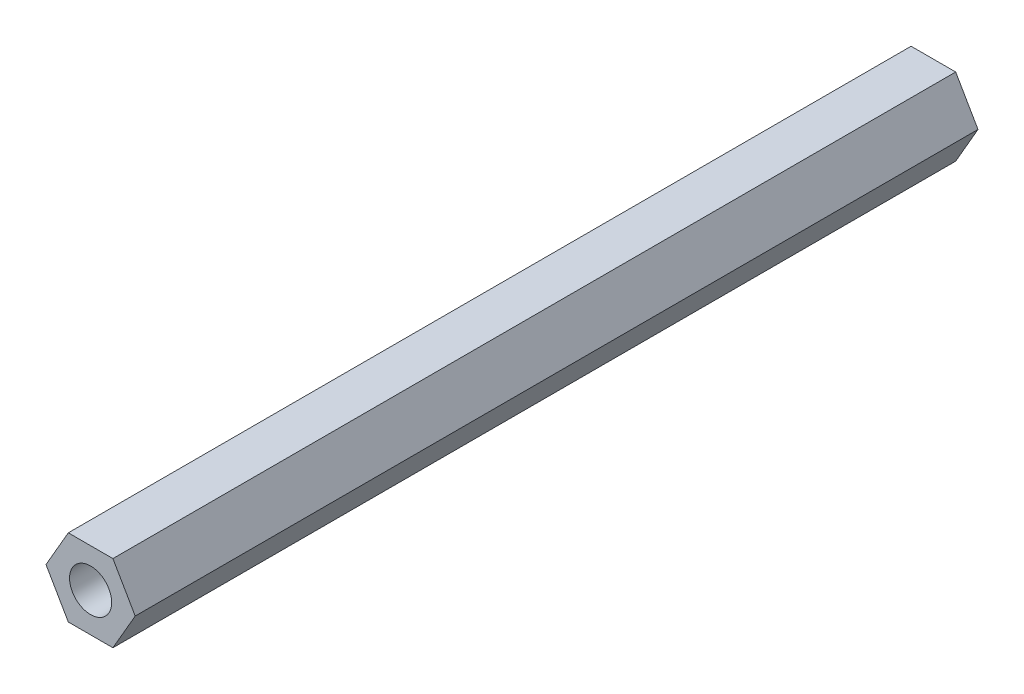
ISO-10303-21;
HEADER;
FILE_DESCRIPTION(('STEP AP214'),'2;1');
FILE_NAME('part.step','',(''),(''),'','','');
FILE_SCHEMA(('AUTOMOTIVE_DESIGN { 1 0 10303 214 1 1 1 1 }'));
ENDSEC;
DATA;
#1=APPLICATION_CONTEXT('core data for automotive mechanical design processes');
#2=APPLICATION_PROTOCOL_DEFINITION('international standard','automotive_design',2000,#1);
#3=PRODUCT_CONTEXT('',#1,'mechanical');
#4=PRODUCT('Part','Part','',(#3));
#5=PRODUCT_RELATED_PRODUCT_CATEGORY('part','',(#4));
#6=PRODUCT_DEFINITION_FORMATION('','',#4);
#7=PRODUCT_DEFINITION_CONTEXT('part definition',#1,'design');
#8=PRODUCT_DEFINITION('design','',#6,#7);
#9=PRODUCT_DEFINITION_SHAPE('','',#8);
#10=(LENGTH_UNIT() NAMED_UNIT(*) SI_UNIT(.MILLI.,.METRE.));
#11=(NAMED_UNIT(*) PLANE_ANGLE_UNIT() SI_UNIT($,.RADIAN.));
#12=(NAMED_UNIT(*) SI_UNIT($,.STERADIAN.) SOLID_ANGLE_UNIT());
#13=UNCERTAINTY_MEASURE_WITH_UNIT(LENGTH_MEASURE(1.E-05),#10,'distance_accuracy_value','');
#14=(GEOMETRIC_REPRESENTATION_CONTEXT(3) GLOBAL_UNCERTAINTY_ASSIGNED_CONTEXT((#13)) GLOBAL_UNIT_ASSIGNED_CONTEXT((#10,
#11,#12)) REPRESENTATION_CONTEXT('',''));
#15=CARTESIAN_POINT('',(0.,0.,0.));
#16=DIRECTION('',(0.,0.,1.));
#17=DIRECTION('',(1.,0.,0.));
#18=AXIS2_PLACEMENT_3D('',#15,#16,#17);
#19=CARTESIAN_POINT('',(0.,0.,60.));
#20=DIRECTION('',(0.,0.,1.));
#21=DIRECTION('',(1.,0.,0.));
#22=AXIS2_PLACEMENT_3D('',#19,#20,#21);
#23=PLANE('',#22);
#24=DIRECTION('',(0.499999999999995,0.866025403784441,0.));
#25=VECTOR('',#24,1.);
#26=CARTESIAN_POINT('',(1.5877132402715,-2.74999999999998,60.));
#27=LINE('',#26,#25);
#28=CARTESIAN_POINT('',(1.5877132402715,-2.74999999999998,60.));
#29=VERTEX_POINT('',#28);
#30=CARTESIAN_POINT('',(3.17542648054294,0.,60.));
#31=VERTEX_POINT('',#30);
#32=EDGE_CURVE('E129',#29,#31,#27,.T.);
#33=ORIENTED_EDGE('',*,*,#32,.T.);
#34=DIRECTION('',(-0.500000000000001,0.866025403784438,0.));
#35=VECTOR('',#34,1.);
#36=CARTESIAN_POINT('',(3.17542648054294,0.,60.));
#37=LINE('',#36,#35);
#38=CARTESIAN_POINT('',(1.58771324027147,2.75,60.));
#39=VERTEX_POINT('',#38);
#40=EDGE_CURVE('E87',#31,#39,#37,.T.);
#41=ORIENTED_EDGE('',*,*,#40,.T.);
#42=DIRECTION('',(-1.,0.,0.));
#43=VECTOR('',#42,1.);
#44=CARTESIAN_POINT('',(1.58771324027147,2.75,60.));
#45=LINE('',#44,#43);
#46=CARTESIAN_POINT('',(-1.58771324027148,2.74999999999999,60.));
#47=VERTEX_POINT('',#46);
#48=EDGE_CURVE('E100',#39,#47,#45,.T.);
#49=ORIENTED_EDGE('',*,*,#48,.T.);
#50=DIRECTION('',(-0.499999999999995,-0.866025403784442,0.));
#51=VECTOR('',#50,1.);
#52=CARTESIAN_POINT('',(-1.58771324027148,2.74999999999999,60.));
#53=LINE('',#52,#51);
#54=CARTESIAN_POINT('',(-3.17542648054294,0.,60.));
#55=VERTEX_POINT('',#54);
#56=EDGE_CURVE('E94',#47,#55,#53,.T.);
#57=ORIENTED_EDGE('',*,*,#56,.T.);
#58=DIRECTION('',(0.500000000000007,-0.866025403784435,0.));
#59=VECTOR('',#58,1.);
#60=CARTESIAN_POINT('',(-3.17542648054294,0.,60.));
#61=LINE('',#60,#59);
#62=CARTESIAN_POINT('',(-1.58771324027145,-2.75000000000002,60.));
#63=VERTEX_POINT('',#62);
#64=EDGE_CURVE('E98',#55,#63,#61,.T.);
#65=ORIENTED_EDGE('',*,*,#64,.T.);
#66=DIRECTION('',(1.,0.,0.));
#67=VECTOR('',#66,1.);
#68=CARTESIAN_POINT('',(-1.58771324027145,-2.75000000000002,60.));
#69=LINE('',#68,#67);
#70=EDGE_CURVE('E50',#63,#29,#69,.T.);
#71=ORIENTED_EDGE('',*,*,#70,.T.);
#72=EDGE_LOOP('',(#33,#41,#49,#57,#65,#71));
#73=FACE_BOUND('',#72,.T.);
#74=CARTESIAN_POINT('',(0.,0.,60.));
#75=DIRECTION('',(0.,0.,1.));
#76=DIRECTION('',(1.,0.,0.));
#77=AXIS2_PLACEMENT_3D('',#74,#75,#76);
#78=CIRCLE('',#77,1.5);
#79=CARTESIAN_POINT('',(1.5,0.,60.));
#80=VERTEX_POINT('',#79);
#81=EDGE_CURVE('E122',#80,#80,#78,.T.);
#82=ORIENTED_EDGE('',*,*,#81,.F.);
#83=EDGE_LOOP('',(#82));
#84=FACE_BOUND('',#83,.T.);
#85=ADVANCED_FACE('F33',(#73,#84),#23,.T.);
#86=CARTESIAN_POINT('',(0.,0.,0.));
#87=DIRECTION('',(0.,0.,1.));
#88=DIRECTION('',(1.,0.,0.));
#89=AXIS2_PLACEMENT_3D('',#86,#87,#88);
#90=PLANE('',#89);
#91=DIRECTION('',(0.499999999999995,0.866025403784441,0.));
#92=VECTOR('',#91,1.);
#93=CARTESIAN_POINT('',(1.5877132402715,-2.74999999999998,0.));
#94=LINE('',#93,#92);
#95=CARTESIAN_POINT('',(1.5877132402715,-2.74999999999998,0.));
#96=VERTEX_POINT('',#95);
#97=CARTESIAN_POINT('',(3.17542648054294,0.,0.));
#98=VERTEX_POINT('',#97);
#99=EDGE_CURVE('E118',#96,#98,#94,.T.);
#100=ORIENTED_EDGE('',*,*,#99,.F.);
#101=DIRECTION('',(1.,0.,0.));
#102=VECTOR('',#101,1.);
#103=CARTESIAN_POINT('',(-1.58771324027145,-2.75000000000002,0.));
#104=LINE('',#103,#102);
#105=CARTESIAN_POINT('',(-1.58771324027145,-2.75000000000002,0.));
#106=VERTEX_POINT('',#105);
#107=EDGE_CURVE('E79',#106,#96,#104,.T.);
#108=ORIENTED_EDGE('',*,*,#107,.F.);
#109=DIRECTION('',(0.500000000000007,-0.866025403784435,0.));
#110=VECTOR('',#109,1.);
#111=CARTESIAN_POINT('',(-3.17542648054294,0.,0.));
#112=LINE('',#111,#110);
#113=CARTESIAN_POINT('',(-3.17542648054294,0.,0.));
#114=VERTEX_POINT('',#113);
#115=EDGE_CURVE('E73',#114,#106,#112,.T.);
#116=ORIENTED_EDGE('',*,*,#115,.F.);
#117=DIRECTION('',(-0.499999999999995,-0.866025403784442,0.));
#118=VECTOR('',#117,1.);
#119=CARTESIAN_POINT('',(-1.58771324027148,2.74999999999999,0.));
#120=LINE('',#119,#118);
#121=CARTESIAN_POINT('',(-1.58771324027148,2.74999999999999,0.));
#122=VERTEX_POINT('',#121);
#123=EDGE_CURVE('E108',#122,#114,#120,.T.);
#124=ORIENTED_EDGE('',*,*,#123,.F.);
#125=DIRECTION('',(-1.,0.,0.));
#126=VECTOR('',#125,1.);
#127=CARTESIAN_POINT('',(1.58771324027147,2.75,0.));
#128=LINE('',#127,#126);
#129=CARTESIAN_POINT('',(1.58771324027147,2.75,0.));
#130=VERTEX_POINT('',#129);
#131=EDGE_CURVE('E124',#130,#122,#128,.T.);
#132=ORIENTED_EDGE('',*,*,#131,.F.);
#133=DIRECTION('',(-0.500000000000001,0.866025403784438,0.));
#134=VECTOR('',#133,1.);
#135=CARTESIAN_POINT('',(3.17542648054294,0.,0.));
#136=LINE('',#135,#134);
#137=EDGE_CURVE('E121',#98,#130,#136,.T.);
#138=ORIENTED_EDGE('',*,*,#137,.F.);
#139=EDGE_LOOP('',(#100,#108,#116,#124,#132,#138));
#140=FACE_BOUND('',#139,.T.);
#141=CARTESIAN_POINT('',(0.,0.,0.));
#142=DIRECTION('',(0.,0.,1.));
#143=DIRECTION('',(1.,0.,0.));
#144=AXIS2_PLACEMENT_3D('',#141,#142,#143);
#145=CIRCLE('',#144,1.5);
#146=CARTESIAN_POINT('',(1.5,0.,0.));
#147=VERTEX_POINT('',#146);
#148=EDGE_CURVE('E222',#147,#147,#145,.T.);
#149=ORIENTED_EDGE('',*,*,#148,.T.);
#150=EDGE_LOOP('',(#149));
#151=FACE_BOUND('',#150,.T.);
#152=ADVANCED_FACE('F138',(#140,#151),#90,.F.);
#153=CARTESIAN_POINT('',(1.5877132402715,-2.74999999999998,60.));
#154=DIRECTION('',(-0.866025403784441,0.499999999999995,0.));
#155=DIRECTION('',(-0.499999999999995,-0.866025403784442,0.));
#156=AXIS2_PLACEMENT_3D('',#153,#154,#155);
#157=PLANE('',#156);
#158=ORIENTED_EDGE('',*,*,#99,.T.);
#159=DIRECTION('',(0.,0.,-1.));
#160=VECTOR('',#159,1.);
#161=CARTESIAN_POINT('',(3.17542648054294,0.,60.));
#162=LINE('',#161,#160);
#163=EDGE_CURVE('E11',#31,#98,#162,.T.);
#164=ORIENTED_EDGE('',*,*,#163,.F.);
#165=ORIENTED_EDGE('',*,*,#32,.F.);
#166=DIRECTION('',(0.,0.,-1.));
#167=VECTOR('',#166,1.);
#168=CARTESIAN_POINT('',(1.5877132402715,-2.74999999999998,60.));
#169=LINE('',#168,#167);
#170=EDGE_CURVE('E114',#29,#96,#169,.T.);
#171=ORIENTED_EDGE('',*,*,#170,.T.);
#172=EDGE_LOOP('',(#158,#164,#165,#171));
#173=FACE_BOUND('',#172,.T.);
#174=ADVANCED_FACE('F35',(#173),#157,.F.);
#175=CARTESIAN_POINT('',(3.17542648054294,0.,60.));
#176=DIRECTION('',(-0.866025403784438,-0.500000000000001,0.));
#177=DIRECTION('',(0.500000000000001,-0.866025403784438,0.));
#178=AXIS2_PLACEMENT_3D('',#175,#176,#177);
#179=PLANE('',#178);
#180=ORIENTED_EDGE('',*,*,#137,.T.);
#181=DIRECTION('',(0.,0.,-1.));
#182=VECTOR('',#181,1.);
#183=CARTESIAN_POINT('',(1.58771324027147,2.75,60.));
#184=LINE('',#183,#182);
#185=EDGE_CURVE('E42',#39,#130,#184,.T.);
#186=ORIENTED_EDGE('',*,*,#185,.F.);
#187=ORIENTED_EDGE('',*,*,#40,.F.);
#188=ORIENTED_EDGE('',*,*,#163,.T.);
#189=EDGE_LOOP('',(#180,#186,#187,#188));
#190=FACE_BOUND('',#189,.T.);
#191=ADVANCED_FACE('F163',(#190),#179,.F.);
#192=CARTESIAN_POINT('',(1.58771324027147,2.75,60.));
#193=DIRECTION('',(0.,-1.,0.));
#194=DIRECTION('',(1.,0.,0.));
#195=AXIS2_PLACEMENT_3D('',#192,#193,#194);
#196=PLANE('',#195);
#197=ORIENTED_EDGE('',*,*,#131,.T.);
#198=DIRECTION('',(0.,0.,-1.));
#199=VECTOR('',#198,1.);
#200=CARTESIAN_POINT('',(-1.58771324027148,2.74999999999999,60.));
#201=LINE('',#200,#199);
#202=EDGE_CURVE('E109',#47,#122,#201,.T.);
#203=ORIENTED_EDGE('',*,*,#202,.F.);
#204=ORIENTED_EDGE('',*,*,#48,.F.);
#205=ORIENTED_EDGE('',*,*,#185,.T.);
#206=EDGE_LOOP('',(#197,#203,#204,#205));
#207=FACE_BOUND('',#206,.T.);
#208=ADVANCED_FACE('F135',(#207),#196,.F.);
#209=CARTESIAN_POINT('',(-1.58771324027148,2.74999999999999,60.));
#210=DIRECTION('',(0.866025403784441,-0.499999999999995,0.));
#211=DIRECTION('',(0.499999999999995,0.866025403784442,0.));
#212=AXIS2_PLACEMENT_3D('',#209,#210,#211);
#213=PLANE('',#212);
#214=ORIENTED_EDGE('',*,*,#123,.T.);
#215=DIRECTION('',(0.,0.,-1.));
#216=VECTOR('',#215,1.);
#217=CARTESIAN_POINT('',(-3.17542648054294,0.,60.));
#218=LINE('',#217,#216);
#219=EDGE_CURVE('E105',#55,#114,#218,.T.);
#220=ORIENTED_EDGE('',*,*,#219,.F.);
#221=ORIENTED_EDGE('',*,*,#56,.F.);
#222=ORIENTED_EDGE('',*,*,#202,.T.);
#223=EDGE_LOOP('',(#214,#220,#221,#222));
#224=FACE_BOUND('',#223,.T.);
#225=ADVANCED_FACE('F106',(#224),#213,.F.);
#226=CARTESIAN_POINT('',(-3.17542648054294,0.,60.));
#227=DIRECTION('',(0.866025403784435,0.500000000000007,0.));
#228=DIRECTION('',(-0.500000000000007,0.866025403784435,0.));
#229=AXIS2_PLACEMENT_3D('',#226,#227,#228);
#230=PLANE('',#229);
#231=ORIENTED_EDGE('',*,*,#115,.T.);
#232=DIRECTION('',(0.,0.,-1.));
#233=VECTOR('',#232,1.);
#234=CARTESIAN_POINT('',(-1.58771324027145,-2.75000000000002,60.));
#235=LINE('',#234,#233);
#236=EDGE_CURVE('E110',#63,#106,#235,.T.);
#237=ORIENTED_EDGE('',*,*,#236,.F.);
#238=ORIENTED_EDGE('',*,*,#64,.F.);
#239=ORIENTED_EDGE('',*,*,#219,.T.);
#240=EDGE_LOOP('',(#231,#237,#238,#239));
#241=FACE_BOUND('',#240,.T.);
#242=ADVANCED_FACE('F112',(#241),#230,.F.);
#243=CARTESIAN_POINT('',(-1.58771324027145,-2.75000000000002,60.));
#244=DIRECTION('',(0.,1.,0.));
#245=DIRECTION('',(-1.,0.,0.));
#246=AXIS2_PLACEMENT_3D('',#243,#244,#245);
#247=PLANE('',#246);
#248=ORIENTED_EDGE('',*,*,#107,.T.);
#249=ORIENTED_EDGE('',*,*,#170,.F.);
#250=ORIENTED_EDGE('',*,*,#70,.F.);
#251=ORIENTED_EDGE('',*,*,#236,.T.);
#252=EDGE_LOOP('',(#248,#249,#250,#251));
#253=FACE_BOUND('',#252,.T.);
#254=ADVANCED_FACE('F143',(#253),#247,.F.);
#255=CARTESIAN_POINT('',(0.,0.,60.));
#256=DIRECTION('',(0.,0.,-1.));
#257=DIRECTION('',(-1.,0.,0.));
#258=AXIS2_PLACEMENT_3D('',#255,#256,#257);
#259=CYLINDRICAL_SURFACE('',#258,1.5);
#260=ORIENTED_EDGE('',*,*,#81,.T.);
#261=EDGE_LOOP('',(#260));
#262=FACE_BOUND('',#261,.T.);
#263=ORIENTED_EDGE('',*,*,#148,.F.);
#264=EDGE_LOOP('',(#263));
#265=FACE_BOUND('',#264,.T.);
#266=ADVANCED_FACE('F145',(#262,#265),#259,.F.);
#267=CLOSED_SHELL('',(#85,#152,#174,#191,#208,#225,#242,#254,#266));
#268=MANIFOLD_SOLID_BREP('B2',#267);
#269=ADVANCED_BREP_SHAPE_REPRESENTATION('',(#18,#268),#14);
#270=SHAPE_DEFINITION_REPRESENTATION(#9,#269);
ENDSEC;
END-ISO-10303-21;
